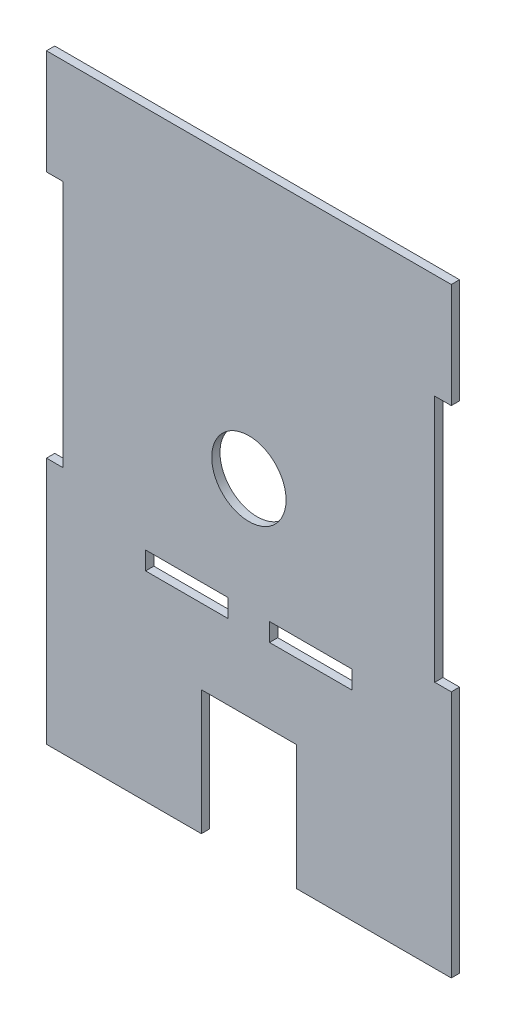
ISO-10303-21;
HEADER;
FILE_DESCRIPTION(('STEP AP214'),'2;1');
FILE_NAME('part.step','',(''),(''),'','','');
FILE_SCHEMA(('AUTOMOTIVE_DESIGN { 1 0 10303 214 1 1 1 1 }'));
ENDSEC;
DATA;
#1=APPLICATION_CONTEXT('core data for automotive mechanical design processes');
#2=APPLICATION_PROTOCOL_DEFINITION('international standard','automotive_design',2000,#1);
#3=PRODUCT_CONTEXT('',#1,'mechanical');
#4=PRODUCT('Part','Part','',(#3));
#5=PRODUCT_RELATED_PRODUCT_CATEGORY('part','',(#4));
#6=PRODUCT_DEFINITION_FORMATION('','',#4);
#7=PRODUCT_DEFINITION_CONTEXT('part definition',#1,'design');
#8=PRODUCT_DEFINITION('design','',#6,#7);
#9=PRODUCT_DEFINITION_SHAPE('','',#8);
#10=(LENGTH_UNIT() NAMED_UNIT(*) SI_UNIT(.MILLI.,.METRE.));
#11=(NAMED_UNIT(*) PLANE_ANGLE_UNIT() SI_UNIT($,.RADIAN.));
#12=(NAMED_UNIT(*) SI_UNIT($,.STERADIAN.) SOLID_ANGLE_UNIT());
#13=UNCERTAINTY_MEASURE_WITH_UNIT(LENGTH_MEASURE(1.E-05),#10,'distance_accuracy_value','');
#14=(GEOMETRIC_REPRESENTATION_CONTEXT(3) GLOBAL_UNCERTAINTY_ASSIGNED_CONTEXT((#13)) GLOBAL_UNIT_ASSIGNED_CONTEXT((#10,
#11,#12)) REPRESENTATION_CONTEXT('',''));
#15=CARTESIAN_POINT('',(0.,0.,0.));
#16=DIRECTION('',(0.,0.,1.));
#17=DIRECTION('',(1.,0.,0.));
#18=AXIS2_PLACEMENT_3D('',#15,#16,#17);
#19=CARTESIAN_POINT('',(0.,0.,1.));
#20=DIRECTION('',(0.,0.,-1.));
#21=DIRECTION('',(-1.,0.,0.));
#22=AXIS2_PLACEMENT_3D('',#19,#20,#21);
#23=PLANE('',#22);
#24=DIRECTION('',(1.,0.,0.));
#25=VECTOR('',#24,1.);
#26=CARTESIAN_POINT('',(31.2820184100364,27.8252807349729,1.));
#27=LINE('',#26,#25);
#28=CARTESIAN_POINT('',(31.2820184100364,27.8252807349729,1.));
#29=VERTEX_POINT('',#28);
#30=CARTESIAN_POINT('',(41.2820184100364,27.8252807349729,1.));
#31=VERTEX_POINT('',#30);
#32=EDGE_CURVE('E249',#29,#31,#27,.T.);
#33=ORIENTED_EDGE('',*,*,#32,.F.);
#34=DIRECTION('',(0.,-1.,0.));
#35=VECTOR('',#34,1.);
#36=CARTESIAN_POINT('',(31.2820184100364,27.8252807349729,1.));
#37=LINE('',#36,#35);
#38=CARTESIAN_POINT('',(31.2820184100364,30.0252807349739,1.));
#39=VERTEX_POINT('',#38);
#40=EDGE_CURVE('E260',#39,#29,#37,.T.);
#41=ORIENTED_EDGE('',*,*,#40,.F.);
#42=DIRECTION('',(-1.,0.,0.));
#43=VECTOR('',#42,1.);
#44=CARTESIAN_POINT('',(41.2820184100364,30.0252807349739,1.));
#45=LINE('',#44,#43);
#46=CARTESIAN_POINT('',(41.2820184100364,30.0252807349739,1.));
#47=VERTEX_POINT('',#46);
#48=EDGE_CURVE('E256',#47,#39,#45,.T.);
#49=ORIENTED_EDGE('',*,*,#48,.F.);
#50=DIRECTION('',(0.,1.,0.));
#51=VECTOR('',#50,1.);
#52=CARTESIAN_POINT('',(41.2820184100364,27.8252807349729,1.));
#53=LINE('',#52,#51);
#54=EDGE_CURVE('E252',#31,#47,#53,.T.);
#55=ORIENTED_EDGE('',*,*,#54,.F.);
#56=EDGE_LOOP('',(#33,#41,#49,#55));
#57=FACE_BOUND('',#56,.T.);
#58=DIRECTION('',(1.,0.,0.));
#59=VECTOR('',#58,1.);
#60=CARTESIAN_POINT('',(23.0320184100396,3.65221733864315,1.));
#61=LINE('',#60,#59);
#62=CARTESIAN_POINT('',(4.2820184100225,3.65221733864315,1.));
#63=VERTEX_POINT('',#62);
#64=CARTESIAN_POINT('',(23.0320184100396,3.65221733864315,1.));
#65=VERTEX_POINT('',#64);
#66=EDGE_CURVE('E300',#63,#65,#61,.T.);
#67=ORIENTED_EDGE('',*,*,#66,.T.);
#68=DIRECTION('',(0.,1.,0.));
#69=VECTOR('',#68,1.);
#70=CARTESIAN_POINT('',(23.0320184100396,18.7522173386419,1.));
#71=LINE('',#70,#69);
#72=CARTESIAN_POINT('',(23.0320184100396,18.7522173386419,1.));
#73=VERTEX_POINT('',#72);
#74=EDGE_CURVE('E304',#65,#73,#71,.T.);
#75=ORIENTED_EDGE('',*,*,#74,.T.);
#76=DIRECTION('',(1.,0.,0.));
#77=VECTOR('',#76,1.);
#78=CARTESIAN_POINT('',(28.78201841004,18.7522173386419,1.));
#79=LINE('',#78,#77);
#80=CARTESIAN_POINT('',(34.53201841004,18.7522173386419,1.));
#81=VERTEX_POINT('',#80);
#82=EDGE_CURVE('E308',#73,#81,#79,.T.);
#83=ORIENTED_EDGE('',*,*,#82,.T.);
#84=DIRECTION('',(0.,-1.,0.));
#85=VECTOR('',#84,1.);
#86=CARTESIAN_POINT('',(34.53201841004,3.65221733864315,1.));
#87=LINE('',#86,#85);
#88=CARTESIAN_POINT('',(34.53201841004,3.65221733864315,1.));
#89=VERTEX_POINT('',#88);
#90=EDGE_CURVE('E311',#81,#89,#87,.T.);
#91=ORIENTED_EDGE('',*,*,#90,.T.);
#92=DIRECTION('',(1.,0.,0.));
#93=VECTOR('',#92,1.);
#94=CARTESIAN_POINT('',(53.2820184100396,3.65221733864315,1.));
#95=LINE('',#94,#93);
#96=CARTESIAN_POINT('',(53.2820184100396,3.65221733864315,1.));
#97=VERTEX_POINT('',#96);
#98=EDGE_CURVE('E314',#89,#97,#95,.T.);
#99=ORIENTED_EDGE('',*,*,#98,.T.);
#100=DIRECTION('',(0.,1.,0.));
#101=VECTOR('',#100,1.);
#102=CARTESIAN_POINT('',(53.2820184100396,33.6522173386441,1.));
#103=LINE('',#102,#101);
#104=CARTESIAN_POINT('',(53.2820184100396,33.6522173386441,1.));
#105=VERTEX_POINT('',#104);
#106=EDGE_CURVE('E317',#97,#105,#103,.T.);
#107=ORIENTED_EDGE('',*,*,#106,.T.);
#108=DIRECTION('',(-1.,0.,0.));
#109=VECTOR('',#108,1.);
#110=CARTESIAN_POINT('',(53.2820184100396,33.6522173386441,1.));
#111=LINE('',#110,#109);
#112=CARTESIAN_POINT('',(51.28201841004,33.6522173386441,1.));
#113=VERTEX_POINT('',#112);
#114=EDGE_CURVE('E320',#105,#113,#111,.T.);
#115=ORIENTED_EDGE('',*,*,#114,.T.);
#116=DIRECTION('',(0.,1.,0.));
#117=VECTOR('',#116,1.);
#118=CARTESIAN_POINT('',(51.28201841004,63.6522173386432,1.));
#119=LINE('',#118,#117);
#120=CARTESIAN_POINT('',(51.28201841004,63.6522173386432,1.));
#121=VERTEX_POINT('',#120);
#122=EDGE_CURVE('E323',#113,#121,#119,.T.);
#123=ORIENTED_EDGE('',*,*,#122,.T.);
#124=DIRECTION('',(1.,0.,0.));
#125=VECTOR('',#124,1.);
#126=CARTESIAN_POINT('',(53.2820184100396,63.6522173386432,1.));
#127=LINE('',#126,#125);
#128=CARTESIAN_POINT('',(53.2820184100396,63.6522173386432,1.));
#129=VERTEX_POINT('',#128);
#130=EDGE_CURVE('E326',#121,#129,#127,.T.);
#131=ORIENTED_EDGE('',*,*,#130,.T.);
#132=DIRECTION('',(0.,1.,0.));
#133=VECTOR('',#132,1.);
#134=CARTESIAN_POINT('',(53.2820184100396,76.3538627526525,1.));
#135=LINE('',#134,#133);
#136=CARTESIAN_POINT('',(53.2820184100396,76.3538627526525,1.));
#137=VERTEX_POINT('',#136);
#138=EDGE_CURVE('E329',#129,#137,#135,.T.);
#139=ORIENTED_EDGE('',*,*,#138,.T.);
#140=DIRECTION('',(-1.,0.,0.));
#141=VECTOR('',#140,1.);
#142=CARTESIAN_POINT('',(4.2820184100225,76.3538627526525,1.));
#143=LINE('',#142,#141);
#144=CARTESIAN_POINT('',(4.2820184100225,76.3538627526525,1.));
#145=VERTEX_POINT('',#144);
#146=EDGE_CURVE('E332',#137,#145,#143,.T.);
#147=ORIENTED_EDGE('',*,*,#146,.T.);
#148=DIRECTION('',(0.,-1.,0.));
#149=VECTOR('',#148,1.);
#150=CARTESIAN_POINT('',(4.2820184100225,76.3538627526525,1.));
#151=LINE('',#150,#149);
#152=CARTESIAN_POINT('',(4.2820184100225,63.6522173386432,1.));
#153=VERTEX_POINT('',#152);
#154=EDGE_CURVE('E335',#145,#153,#151,.T.);
#155=ORIENTED_EDGE('',*,*,#154,.T.);
#156=DIRECTION('',(1.,0.,0.));
#157=VECTOR('',#156,1.);
#158=CARTESIAN_POINT('',(4.2820184100225,63.6522173386432,1.));
#159=LINE('',#158,#157);
#160=CARTESIAN_POINT('',(6.2820184100225,63.6522173386432,1.));
#161=VERTEX_POINT('',#160);
#162=EDGE_CURVE('E338',#153,#161,#159,.T.);
#163=ORIENTED_EDGE('',*,*,#162,.T.);
#164=DIRECTION('',(0.,-1.,0.));
#165=VECTOR('',#164,1.);
#166=CARTESIAN_POINT('',(6.2820184100225,63.6522173386432,1.));
#167=LINE('',#166,#165);
#168=CARTESIAN_POINT('',(6.2820184100225,33.6522173386441,1.));
#169=VERTEX_POINT('',#168);
#170=EDGE_CURVE('E341',#161,#169,#167,.T.);
#171=ORIENTED_EDGE('',*,*,#170,.T.);
#172=DIRECTION('',(-1.,0.,0.));
#173=VECTOR('',#172,1.);
#174=CARTESIAN_POINT('',(4.2820184100225,33.6522173386441,1.));
#175=LINE('',#174,#173);
#176=CARTESIAN_POINT('',(4.2820184100225,33.6522173386441,1.));
#177=VERTEX_POINT('',#176);
#178=EDGE_CURVE('E344',#169,#177,#175,.T.);
#179=ORIENTED_EDGE('',*,*,#178,.T.);
#180=DIRECTION('',(0.,-1.,0.));
#181=VECTOR('',#180,1.);
#182=CARTESIAN_POINT('',(4.2820184100225,3.65221733864315,1.));
#183=LINE('',#182,#181);
#184=EDGE_CURVE('E347',#177,#63,#183,.T.);
#185=ORIENTED_EDGE('',*,*,#184,.T.);
#186=EDGE_LOOP('',(#67,#75,#83,#91,#99,#107,#115,#123,#131,#139,#147,#155,#163,#171,#179,#185));
#187=FACE_BOUND('',#186,.T.);
#188=CARTESIAN_POINT('',(28.78201841004,43.7522173386419,1.));
#189=DIRECTION('',(0.,0.,1.));
#190=DIRECTION('',(1.,0.,0.));
#191=AXIS2_PLACEMENT_3D('',#188,#189,#190);
#192=CIRCLE('',#191,4.5);
#193=CARTESIAN_POINT('',(33.28201841004,43.7522173386419,1.));
#194=VERTEX_POINT('',#193);
#195=EDGE_CURVE('E292',#194,#194,#192,.T.);
#196=ORIENTED_EDGE('',*,*,#195,.F.);
#197=EDGE_LOOP('',(#196));
#198=FACE_BOUND('',#197,.T.);
#199=DIRECTION('',(1.,0.,0.));
#200=VECTOR('',#199,1.);
#201=CARTESIAN_POINT('',(26.2820184100423,27.8252807349729,1.));
#202=LINE('',#201,#200);
#203=CARTESIAN_POINT('',(16.2820184100432,27.8252807349729,1.));
#204=VERTEX_POINT('',#203);
#205=CARTESIAN_POINT('',(26.2820184100423,27.8252807349729,1.));
#206=VERTEX_POINT('',#205);
#207=EDGE_CURVE('E201',#204,#206,#202,.T.);
#208=ORIENTED_EDGE('',*,*,#207,.F.);
#209=DIRECTION('',(0.,-1.,0.));
#210=VECTOR('',#209,1.);
#211=CARTESIAN_POINT('',(16.2820184100432,27.8252807349729,1.));
#212=LINE('',#211,#210);
#213=CARTESIAN_POINT('',(16.2820184100432,30.0252807349739,1.));
#214=VERTEX_POINT('',#213);
#215=EDGE_CURVE('E227',#214,#204,#212,.T.);
#216=ORIENTED_EDGE('',*,*,#215,.F.);
#217=DIRECTION('',(-1.,0.,0.));
#218=VECTOR('',#217,1.);
#219=CARTESIAN_POINT('',(26.2820184100423,30.0252807349739,1.));
#220=LINE('',#219,#218);
#221=CARTESIAN_POINT('',(26.2820184100423,30.0252807349739,1.));
#222=VERTEX_POINT('',#221);
#223=EDGE_CURVE('E223',#222,#214,#220,.T.);
#224=ORIENTED_EDGE('',*,*,#223,.F.);
#225=DIRECTION('',(0.,1.,0.));
#226=VECTOR('',#225,1.);
#227=CARTESIAN_POINT('',(26.2820184100423,27.8252807349729,1.));
#228=LINE('',#227,#226);
#229=EDGE_CURVE('E210',#206,#222,#228,.T.);
#230=ORIENTED_EDGE('',*,*,#229,.F.);
#231=EDGE_LOOP('',(#208,#216,#224,#230));
#232=FACE_BOUND('',#231,.T.);
#233=ADVANCED_FACE('F39',(#57,#187,#198,#232),#23,.F.);
#234=CARTESIAN_POINT('',(0.,0.,0.));
#235=DIRECTION('',(0.,0.,-1.));
#236=DIRECTION('',(-1.,0.,0.));
#237=AXIS2_PLACEMENT_3D('',#234,#235,#236);
#238=PLANE('',#237);
#239=DIRECTION('',(1.,0.,0.));
#240=VECTOR('',#239,1.);
#241=CARTESIAN_POINT('',(23.0320184100396,3.65221733864315,0.));
#242=LINE('',#241,#240);
#243=CARTESIAN_POINT('',(4.2820184100225,3.65221733864315,0.));
#244=VERTEX_POINT('',#243);
#245=CARTESIAN_POINT('',(23.0320184100396,3.65221733864315,0.));
#246=VERTEX_POINT('',#245);
#247=EDGE_CURVE('E296',#244,#246,#242,.T.);
#248=ORIENTED_EDGE('',*,*,#247,.F.);
#249=DIRECTION('',(0.,-1.,0.));
#250=VECTOR('',#249,1.);
#251=CARTESIAN_POINT('',(4.2820184100225,3.65221733864315,0.));
#252=LINE('',#251,#250);
#253=CARTESIAN_POINT('',(4.2820184100225,33.6522173386441,0.));
#254=VERTEX_POINT('',#253);
#255=EDGE_CURVE('E305',#254,#244,#252,.T.);
#256=ORIENTED_EDGE('',*,*,#255,.F.);
#257=DIRECTION('',(-1.,0.,0.));
#258=VECTOR('',#257,1.);
#259=CARTESIAN_POINT('',(4.2820184100225,33.6522173386441,0.));
#260=LINE('',#259,#258);
#261=CARTESIAN_POINT('',(6.2820184100225,33.6522173386441,0.));
#262=VERTEX_POINT('',#261);
#263=EDGE_CURVE('E394',#262,#254,#260,.T.);
#264=ORIENTED_EDGE('',*,*,#263,.F.);
#265=DIRECTION('',(0.,-1.,0.));
#266=VECTOR('',#265,1.);
#267=CARTESIAN_POINT('',(6.2820184100225,63.6522173386432,0.));
#268=LINE('',#267,#266);
#269=CARTESIAN_POINT('',(6.2820184100225,63.6522173386432,0.));
#270=VERTEX_POINT('',#269);
#271=EDGE_CURVE('E391',#270,#262,#268,.T.);
#272=ORIENTED_EDGE('',*,*,#271,.F.);
#273=DIRECTION('',(1.,0.,0.));
#274=VECTOR('',#273,1.);
#275=CARTESIAN_POINT('',(4.2820184100225,63.6522173386432,0.));
#276=LINE('',#275,#274);
#277=CARTESIAN_POINT('',(4.2820184100225,63.6522173386432,0.));
#278=VERTEX_POINT('',#277);
#279=EDGE_CURVE('E388',#278,#270,#276,.T.);
#280=ORIENTED_EDGE('',*,*,#279,.F.);
#281=DIRECTION('',(0.,-1.,0.));
#282=VECTOR('',#281,1.);
#283=CARTESIAN_POINT('',(4.2820184100225,76.3538627526525,0.));
#284=LINE('',#283,#282);
#285=CARTESIAN_POINT('',(4.2820184100225,76.3538627526525,0.));
#286=VERTEX_POINT('',#285);
#287=EDGE_CURVE('E385',#286,#278,#284,.T.);
#288=ORIENTED_EDGE('',*,*,#287,.F.);
#289=DIRECTION('',(-1.,0.,0.));
#290=VECTOR('',#289,1.);
#291=CARTESIAN_POINT('',(4.2820184100225,76.3538627526525,0.));
#292=LINE('',#291,#290);
#293=CARTESIAN_POINT('',(53.2820184100396,76.3538627526525,0.));
#294=VERTEX_POINT('',#293);
#295=EDGE_CURVE('E382',#294,#286,#292,.T.);
#296=ORIENTED_EDGE('',*,*,#295,.F.);
#297=DIRECTION('',(0.,1.,0.));
#298=VECTOR('',#297,1.);
#299=CARTESIAN_POINT('',(53.2820184100396,76.3538627526525,0.));
#300=LINE('',#299,#298);
#301=CARTESIAN_POINT('',(53.2820184100396,63.6522173386432,0.));
#302=VERTEX_POINT('',#301);
#303=EDGE_CURVE('E379',#302,#294,#300,.T.);
#304=ORIENTED_EDGE('',*,*,#303,.F.);
#305=DIRECTION('',(1.,0.,0.));
#306=VECTOR('',#305,1.);
#307=CARTESIAN_POINT('',(53.2820184100396,63.6522173386432,0.));
#308=LINE('',#307,#306);
#309=CARTESIAN_POINT('',(51.28201841004,63.6522173386432,0.));
#310=VERTEX_POINT('',#309);
#311=EDGE_CURVE('E376',#310,#302,#308,.T.);
#312=ORIENTED_EDGE('',*,*,#311,.F.);
#313=DIRECTION('',(0.,1.,0.));
#314=VECTOR('',#313,1.);
#315=CARTESIAN_POINT('',(51.28201841004,63.6522173386432,0.));
#316=LINE('',#315,#314);
#317=CARTESIAN_POINT('',(51.28201841004,33.6522173386441,0.));
#318=VERTEX_POINT('',#317);
#319=EDGE_CURVE('E373',#318,#310,#316,.T.);
#320=ORIENTED_EDGE('',*,*,#319,.F.);
#321=DIRECTION('',(-1.,0.,0.));
#322=VECTOR('',#321,1.);
#323=CARTESIAN_POINT('',(53.2820184100396,33.6522173386441,0.));
#324=LINE('',#323,#322);
#325=CARTESIAN_POINT('',(53.2820184100396,33.6522173386441,0.));
#326=VERTEX_POINT('',#325);
#327=EDGE_CURVE('E370',#326,#318,#324,.T.);
#328=ORIENTED_EDGE('',*,*,#327,.F.);
#329=DIRECTION('',(0.,1.,0.));
#330=VECTOR('',#329,1.);
#331=CARTESIAN_POINT('',(53.2820184100396,33.6522173386441,0.));
#332=LINE('',#331,#330);
#333=CARTESIAN_POINT('',(53.2820184100396,3.65221733864315,0.));
#334=VERTEX_POINT('',#333);
#335=EDGE_CURVE('E367',#334,#326,#332,.T.);
#336=ORIENTED_EDGE('',*,*,#335,.F.);
#337=DIRECTION('',(1.,0.,0.));
#338=VECTOR('',#337,1.);
#339=CARTESIAN_POINT('',(53.2820184100396,3.65221733864315,0.));
#340=LINE('',#339,#338);
#341=CARTESIAN_POINT('',(34.53201841004,3.65221733864315,0.));
#342=VERTEX_POINT('',#341);
#343=EDGE_CURVE('E364',#342,#334,#340,.T.);
#344=ORIENTED_EDGE('',*,*,#343,.F.);
#345=DIRECTION('',(0.,-1.,0.));
#346=VECTOR('',#345,1.);
#347=CARTESIAN_POINT('',(34.53201841004,3.65221733864315,0.));
#348=LINE('',#347,#346);
#349=CARTESIAN_POINT('',(34.53201841004,18.7522173386419,0.));
#350=VERTEX_POINT('',#349);
#351=EDGE_CURVE('E361',#350,#342,#348,.T.);
#352=ORIENTED_EDGE('',*,*,#351,.F.);
#353=DIRECTION('',(1.,0.,0.));
#354=VECTOR('',#353,1.);
#355=CARTESIAN_POINT('',(34.53201841004,18.7522173386419,0.));
#356=LINE('',#355,#354);
#357=CARTESIAN_POINT('',(23.0320184100396,18.7522173386419,0.));
#358=VERTEX_POINT('',#357);
#359=EDGE_CURVE('E358',#358,#350,#356,.T.);
#360=ORIENTED_EDGE('',*,*,#359,.F.);
#361=DIRECTION('',(0.,1.,0.));
#362=VECTOR('',#361,1.);
#363=CARTESIAN_POINT('',(23.0320184100396,18.7522173386419,0.));
#364=LINE('',#363,#362);
#365=EDGE_CURVE('E354',#246,#358,#364,.T.);
#366=ORIENTED_EDGE('',*,*,#365,.F.);
#367=EDGE_LOOP('',(#248,#256,#264,#272,#280,#288,#296,#304,#312,#320,#328,#336,#344,#352,#360,#366));
#368=FACE_BOUND('',#367,.T.);
#369=CARTESIAN_POINT('',(28.78201841004,43.7522173386419,0.));
#370=DIRECTION('',(0.,0.,1.));
#371=DIRECTION('',(1.,0.,0.));
#372=AXIS2_PLACEMENT_3D('',#369,#370,#371);
#373=CIRCLE('',#372,4.5);
#374=CARTESIAN_POINT('',(33.28201841004,43.7522173386419,0.));
#375=VERTEX_POINT('',#374);
#376=EDGE_CURVE('E291',#375,#375,#373,.T.);
#377=ORIENTED_EDGE('',*,*,#376,.T.);
#378=EDGE_LOOP('',(#377));
#379=FACE_BOUND('',#378,.T.);
#380=DIRECTION('',(0.,-1.,0.));
#381=VECTOR('',#380,1.);
#382=CARTESIAN_POINT('',(31.2820184100364,27.8252807349729,0.));
#383=LINE('',#382,#381);
#384=CARTESIAN_POINT('',(31.2820184100364,30.0252807349739,0.));
#385=VERTEX_POINT('',#384);
#386=CARTESIAN_POINT('',(31.2820184100364,27.8252807349729,0.));
#387=VERTEX_POINT('',#386);
#388=EDGE_CURVE('E253',#385,#387,#383,.T.);
#389=ORIENTED_EDGE('',*,*,#388,.T.);
#390=DIRECTION('',(1.,0.,0.));
#391=VECTOR('',#390,1.);
#392=CARTESIAN_POINT('',(31.2820184100364,27.8252807349729,0.));
#393=LINE('',#392,#391);
#394=CARTESIAN_POINT('',(41.2820184100364,27.8252807349729,0.));
#395=VERTEX_POINT('',#394);
#396=EDGE_CURVE('E219',#387,#395,#393,.T.);
#397=ORIENTED_EDGE('',*,*,#396,.T.);
#398=DIRECTION('',(0.,1.,0.));
#399=VECTOR('',#398,1.);
#400=CARTESIAN_POINT('',(41.2820184100364,27.8252807349729,0.));
#401=LINE('',#400,#399);
#402=CARTESIAN_POINT('',(41.2820184100364,30.0252807349739,0.));
#403=VERTEX_POINT('',#402);
#404=EDGE_CURVE('E267',#395,#403,#401,.T.);
#405=ORIENTED_EDGE('',*,*,#404,.T.);
#406=DIRECTION('',(-1.,0.,0.));
#407=VECTOR('',#406,1.);
#408=CARTESIAN_POINT('',(41.2820184100364,30.0252807349739,0.));
#409=LINE('',#408,#407);
#410=EDGE_CURVE('E271',#403,#385,#409,.T.);
#411=ORIENTED_EDGE('',*,*,#410,.T.);
#412=EDGE_LOOP('',(#389,#397,#405,#411));
#413=FACE_BOUND('',#412,.T.);
#414=DIRECTION('',(0.,-1.,0.));
#415=VECTOR('',#414,1.);
#416=CARTESIAN_POINT('',(16.2820184100432,27.8252807349729,0.));
#417=LINE('',#416,#415);
#418=CARTESIAN_POINT('',(16.2820184100432,30.0252807349739,0.));
#419=VERTEX_POINT('',#418);
#420=CARTESIAN_POINT('',(16.2820184100432,27.8252807349729,0.));
#421=VERTEX_POINT('',#420);
#422=EDGE_CURVE('E211',#419,#421,#417,.T.);
#423=ORIENTED_EDGE('',*,*,#422,.T.);
#424=DIRECTION('',(1.,0.,0.));
#425=VECTOR('',#424,1.);
#426=CARTESIAN_POINT('',(26.2820184100423,27.8252807349729,0.));
#427=LINE('',#426,#425);
#428=CARTESIAN_POINT('',(26.2820184100423,27.8252807349729,0.));
#429=VERTEX_POINT('',#428);
#430=EDGE_CURVE('E63',#421,#429,#427,.T.);
#431=ORIENTED_EDGE('',*,*,#430,.T.);
#432=DIRECTION('',(0.,1.,0.));
#433=VECTOR('',#432,1.);
#434=CARTESIAN_POINT('',(26.2820184100423,27.8252807349729,0.));
#435=LINE('',#434,#433);
#436=CARTESIAN_POINT('',(26.2820184100423,30.0252807349739,0.));
#437=VERTEX_POINT('',#436);
#438=EDGE_CURVE('E217',#429,#437,#435,.T.);
#439=ORIENTED_EDGE('',*,*,#438,.T.);
#440=DIRECTION('',(-1.,0.,0.));
#441=VECTOR('',#440,1.);
#442=CARTESIAN_POINT('',(26.2820184100423,30.0252807349739,0.));
#443=LINE('',#442,#441);
#444=EDGE_CURVE('E236',#437,#419,#443,.T.);
#445=ORIENTED_EDGE('',*,*,#444,.T.);
#446=EDGE_LOOP('',(#423,#431,#439,#445));
#447=FACE_BOUND('',#446,.T.);
#448=ADVANCED_FACE('F465',(#368,#379,#413,#447),#238,.T.);
#449=CARTESIAN_POINT('',(23.0320184100396,3.65221733864315,1.));
#450=DIRECTION('',(0.,1.,0.));
#451=DIRECTION('',(0.,0.,1.));
#452=AXIS2_PLACEMENT_3D('',#449,#450,#451);
#453=PLANE('',#452);
#454=ORIENTED_EDGE('',*,*,#247,.T.);
#455=DIRECTION('',(0.,0.,-1.));
#456=VECTOR('',#455,1.);
#457=CARTESIAN_POINT('',(23.0320184100396,3.65221733864315,1.));
#458=LINE('',#457,#456);
#459=EDGE_CURVE('E11',#65,#246,#458,.T.);
#460=ORIENTED_EDGE('',*,*,#459,.F.);
#461=ORIENTED_EDGE('',*,*,#66,.F.);
#462=DIRECTION('',(0.,0.,-1.));
#463=VECTOR('',#462,1.);
#464=CARTESIAN_POINT('',(4.2820184100225,3.65221733864315,1.));
#465=LINE('',#464,#463);
#466=EDGE_CURVE('E350',#63,#244,#465,.T.);
#467=ORIENTED_EDGE('',*,*,#466,.T.);
#468=EDGE_LOOP('',(#454,#460,#461,#467));
#469=FACE_BOUND('',#468,.T.);
#470=ADVANCED_FACE('F41',(#469),#453,.F.);
#471=CARTESIAN_POINT('',(23.0320184100396,18.7522173386419,1.));
#472=DIRECTION('',(-1.,0.,0.));
#473=DIRECTION('',(0.,0.,1.));
#474=AXIS2_PLACEMENT_3D('',#471,#472,#473);
#475=PLANE('',#474);
#476=ORIENTED_EDGE('',*,*,#365,.T.);
#477=DIRECTION('',(0.,0.,-1.));
#478=VECTOR('',#477,1.);
#479=CARTESIAN_POINT('',(23.0320184100396,18.7522173386419,1.));
#480=LINE('',#479,#478);
#481=EDGE_CURVE('E48',#73,#358,#480,.T.);
#482=ORIENTED_EDGE('',*,*,#481,.F.);
#483=ORIENTED_EDGE('',*,*,#74,.F.);
#484=ORIENTED_EDGE('',*,*,#459,.T.);
#485=EDGE_LOOP('',(#476,#482,#483,#484));
#486=FACE_BOUND('',#485,.T.);
#487=ADVANCED_FACE('F461',(#486),#475,.F.);
#488=CARTESIAN_POINT('',(34.53201841004,18.7522173386419,1.));
#489=DIRECTION('',(0.,1.,0.));
#490=DIRECTION('',(0.,0.,1.));
#491=AXIS2_PLACEMENT_3D('',#488,#489,#490);
#492=PLANE('',#491);
#493=ORIENTED_EDGE('',*,*,#359,.T.);
#494=DIRECTION('',(0.,0.,-1.));
#495=VECTOR('',#494,1.);
#496=CARTESIAN_POINT('',(34.53201841004,18.7522173386419,1.));
#497=LINE('',#496,#495);
#498=EDGE_CURVE('E450',#81,#350,#497,.T.);
#499=ORIENTED_EDGE('',*,*,#498,.F.);
#500=ORIENTED_EDGE('',*,*,#82,.F.);
#501=ORIENTED_EDGE('',*,*,#481,.T.);
#502=EDGE_LOOP('',(#493,#499,#500,#501));
#503=FACE_BOUND('',#502,.T.);
#504=ADVANCED_FACE('F458',(#503),#492,.F.);
#505=CARTESIAN_POINT('',(34.53201841004,3.65221733864315,1.));
#506=DIRECTION('',(1.,0.,0.));
#507=DIRECTION('',(0.,0.,-1.));
#508=AXIS2_PLACEMENT_3D('',#505,#506,#507);
#509=PLANE('',#508);
#510=ORIENTED_EDGE('',*,*,#351,.T.);
#511=DIRECTION('',(0.,0.,-1.));
#512=VECTOR('',#511,1.);
#513=CARTESIAN_POINT('',(34.53201841004,3.65221733864315,1.));
#514=LINE('',#513,#512);
#515=EDGE_CURVE('E446',#89,#342,#514,.T.);
#516=ORIENTED_EDGE('',*,*,#515,.F.);
#517=ORIENTED_EDGE('',*,*,#90,.F.);
#518=ORIENTED_EDGE('',*,*,#498,.T.);
#519=EDGE_LOOP('',(#510,#516,#517,#518));
#520=FACE_BOUND('',#519,.T.);
#521=ADVANCED_FACE('F473',(#520),#509,.F.);
#522=CARTESIAN_POINT('',(53.2820184100396,3.65221733864315,1.));
#523=DIRECTION('',(0.,1.,0.));
#524=DIRECTION('',(0.,0.,1.));
#525=AXIS2_PLACEMENT_3D('',#522,#523,#524);
#526=PLANE('',#525);
#527=ORIENTED_EDGE('',*,*,#343,.T.);
#528=DIRECTION('',(0.,0.,-1.));
#529=VECTOR('',#528,1.);
#530=CARTESIAN_POINT('',(53.2820184100396,3.65221733864315,1.));
#531=LINE('',#530,#529);
#532=EDGE_CURVE('E442',#97,#334,#531,.T.);
#533=ORIENTED_EDGE('',*,*,#532,.F.);
#534=ORIENTED_EDGE('',*,*,#98,.F.);
#535=ORIENTED_EDGE('',*,*,#515,.T.);
#536=EDGE_LOOP('',(#527,#533,#534,#535));
#537=FACE_BOUND('',#536,.T.);
#538=ADVANCED_FACE('F477',(#537),#526,.F.);
#539=CARTESIAN_POINT('',(53.2820184100396,33.6522173386441,1.));
#540=DIRECTION('',(-1.,0.,0.));
#541=DIRECTION('',(0.,0.,1.));
#542=AXIS2_PLACEMENT_3D('',#539,#540,#541);
#543=PLANE('',#542);
#544=ORIENTED_EDGE('',*,*,#335,.T.);
#545=DIRECTION('',(0.,0.,-1.));
#546=VECTOR('',#545,1.);
#547=CARTESIAN_POINT('',(53.2820184100396,33.6522173386441,1.));
#548=LINE('',#547,#546);
#549=EDGE_CURVE('E438',#105,#326,#548,.T.);
#550=ORIENTED_EDGE('',*,*,#549,.F.);
#551=ORIENTED_EDGE('',*,*,#106,.F.);
#552=ORIENTED_EDGE('',*,*,#532,.T.);
#553=EDGE_LOOP('',(#544,#550,#551,#552));
#554=FACE_BOUND('',#553,.T.);
#555=ADVANCED_FACE('F535',(#554),#543,.F.);
#556=CARTESIAN_POINT('',(53.2820184100396,33.6522173386441,1.));
#557=DIRECTION('',(0.,-1.,0.));
#558=DIRECTION('',(0.,0.,-1.));
#559=AXIS2_PLACEMENT_3D('',#556,#557,#558);
#560=PLANE('',#559);
#561=ORIENTED_EDGE('',*,*,#327,.T.);
#562=DIRECTION('',(0.,0.,-1.));
#563=VECTOR('',#562,1.);
#564=CARTESIAN_POINT('',(51.28201841004,33.6522173386441,1.));
#565=LINE('',#564,#563);
#566=EDGE_CURVE('E434',#113,#318,#565,.T.);
#567=ORIENTED_EDGE('',*,*,#566,.F.);
#568=ORIENTED_EDGE('',*,*,#114,.F.);
#569=ORIENTED_EDGE('',*,*,#549,.T.);
#570=EDGE_LOOP('',(#561,#567,#568,#569));
#571=FACE_BOUND('',#570,.T.);
#572=ADVANCED_FACE('F533',(#571),#560,.F.);
#573=CARTESIAN_POINT('',(51.28201841004,63.6522173386432,1.));
#574=DIRECTION('',(-1.,0.,0.));
#575=DIRECTION('',(0.,0.,1.));
#576=AXIS2_PLACEMENT_3D('',#573,#574,#575);
#577=PLANE('',#576);
#578=ORIENTED_EDGE('',*,*,#319,.T.);
#579=DIRECTION('',(0.,0.,-1.));
#580=VECTOR('',#579,1.);
#581=CARTESIAN_POINT('',(51.28201841004,63.6522173386432,1.));
#582=LINE('',#581,#580);
#583=EDGE_CURVE('E430',#121,#310,#582,.T.);
#584=ORIENTED_EDGE('',*,*,#583,.F.);
#585=ORIENTED_EDGE('',*,*,#122,.F.);
#586=ORIENTED_EDGE('',*,*,#566,.T.);
#587=EDGE_LOOP('',(#578,#584,#585,#586));
#588=FACE_BOUND('',#587,.T.);
#589=ADVANCED_FACE('F529',(#588),#577,.F.);
#590=CARTESIAN_POINT('',(53.2820184100396,63.6522173386432,1.));
#591=DIRECTION('',(0.,1.,0.));
#592=DIRECTION('',(0.,0.,1.));
#593=AXIS2_PLACEMENT_3D('',#590,#591,#592);
#594=PLANE('',#593);
#595=ORIENTED_EDGE('',*,*,#311,.T.);
#596=DIRECTION('',(0.,0.,-1.));
#597=VECTOR('',#596,1.);
#598=CARTESIAN_POINT('',(53.2820184100396,63.6522173386432,1.));
#599=LINE('',#598,#597);
#600=EDGE_CURVE('E426',#129,#302,#599,.T.);
#601=ORIENTED_EDGE('',*,*,#600,.F.);
#602=ORIENTED_EDGE('',*,*,#130,.F.);
#603=ORIENTED_EDGE('',*,*,#583,.T.);
#604=EDGE_LOOP('',(#595,#601,#602,#603));
#605=FACE_BOUND('',#604,.T.);
#606=ADVANCED_FACE('F524',(#605),#594,.F.);
#607=CARTESIAN_POINT('',(53.2820184100396,76.3538627526525,1.));
#608=DIRECTION('',(-1.,0.,0.));
#609=DIRECTION('',(0.,0.,1.));
#610=AXIS2_PLACEMENT_3D('',#607,#608,#609);
#611=PLANE('',#610);
#612=ORIENTED_EDGE('',*,*,#303,.T.);
#613=DIRECTION('',(0.,0.,-1.));
#614=VECTOR('',#613,1.);
#615=CARTESIAN_POINT('',(53.2820184100396,76.3538627526525,1.));
#616=LINE('',#615,#614);
#617=EDGE_CURVE('E422',#137,#294,#616,.T.);
#618=ORIENTED_EDGE('',*,*,#617,.F.);
#619=ORIENTED_EDGE('',*,*,#138,.F.);
#620=ORIENTED_EDGE('',*,*,#600,.T.);
#621=EDGE_LOOP('',(#612,#618,#619,#620));
#622=FACE_BOUND('',#621,.T.);
#623=ADVANCED_FACE('F518',(#622),#611,.F.);
#624=CARTESIAN_POINT('',(4.2820184100225,76.3538627526525,1.));
#625=DIRECTION('',(0.,-1.,0.));
#626=DIRECTION('',(0.,0.,-1.));
#627=AXIS2_PLACEMENT_3D('',#624,#625,#626);
#628=PLANE('',#627);
#629=ORIENTED_EDGE('',*,*,#295,.T.);
#630=DIRECTION('',(0.,0.,-1.));
#631=VECTOR('',#630,1.);
#632=CARTESIAN_POINT('',(4.2820184100225,76.3538627526525,1.));
#633=LINE('',#632,#631);
#634=EDGE_CURVE('E418',#145,#286,#633,.T.);
#635=ORIENTED_EDGE('',*,*,#634,.F.);
#636=ORIENTED_EDGE('',*,*,#146,.F.);
#637=ORIENTED_EDGE('',*,*,#617,.T.);
#638=EDGE_LOOP('',(#629,#635,#636,#637));
#639=FACE_BOUND('',#638,.T.);
#640=ADVANCED_FACE('F514',(#639),#628,.F.);
#641=CARTESIAN_POINT('',(4.2820184100225,76.3538627526525,1.));
#642=DIRECTION('',(1.,0.,0.));
#643=DIRECTION('',(0.,0.,-1.));
#644=AXIS2_PLACEMENT_3D('',#641,#642,#643);
#645=PLANE('',#644);
#646=ORIENTED_EDGE('',*,*,#287,.T.);
#647=DIRECTION('',(0.,0.,-1.));
#648=VECTOR('',#647,1.);
#649=CARTESIAN_POINT('',(4.2820184100225,63.6522173386432,1.));
#650=LINE('',#649,#648);
#651=EDGE_CURVE('E414',#153,#278,#650,.T.);
#652=ORIENTED_EDGE('',*,*,#651,.F.);
#653=ORIENTED_EDGE('',*,*,#154,.F.);
#654=ORIENTED_EDGE('',*,*,#634,.T.);
#655=EDGE_LOOP('',(#646,#652,#653,#654));
#656=FACE_BOUND('',#655,.T.);
#657=ADVANCED_FACE('F509',(#656),#645,.F.);
#658=CARTESIAN_POINT('',(4.2820184100225,63.6522173386432,1.));
#659=DIRECTION('',(0.,1.,0.));
#660=DIRECTION('',(0.,0.,1.));
#661=AXIS2_PLACEMENT_3D('',#658,#659,#660);
#662=PLANE('',#661);
#663=ORIENTED_EDGE('',*,*,#279,.T.);
#664=DIRECTION('',(0.,0.,-1.));
#665=VECTOR('',#664,1.);
#666=CARTESIAN_POINT('',(6.2820184100225,63.6522173386432,1.));
#667=LINE('',#666,#665);
#668=EDGE_CURVE('E410',#161,#270,#667,.T.);
#669=ORIENTED_EDGE('',*,*,#668,.F.);
#670=ORIENTED_EDGE('',*,*,#162,.F.);
#671=ORIENTED_EDGE('',*,*,#651,.T.);
#672=EDGE_LOOP('',(#663,#669,#670,#671));
#673=FACE_BOUND('',#672,.T.);
#674=ADVANCED_FACE('F503',(#673),#662,.F.);
#675=CARTESIAN_POINT('',(6.2820184100225,63.6522173386432,1.));
#676=DIRECTION('',(1.,0.,0.));
#677=DIRECTION('',(0.,0.,-1.));
#678=AXIS2_PLACEMENT_3D('',#675,#676,#677);
#679=PLANE('',#678);
#680=ORIENTED_EDGE('',*,*,#271,.T.);
#681=DIRECTION('',(0.,0.,-1.));
#682=VECTOR('',#681,1.);
#683=CARTESIAN_POINT('',(6.2820184100225,33.6522173386441,1.));
#684=LINE('',#683,#682);
#685=EDGE_CURVE('E406',#169,#262,#684,.T.);
#686=ORIENTED_EDGE('',*,*,#685,.F.);
#687=ORIENTED_EDGE('',*,*,#170,.F.);
#688=ORIENTED_EDGE('',*,*,#668,.T.);
#689=EDGE_LOOP('',(#680,#686,#687,#688));
#690=FACE_BOUND('',#689,.T.);
#691=ADVANCED_FACE('F499',(#690),#679,.F.);
#692=CARTESIAN_POINT('',(4.2820184100225,33.6522173386441,1.));
#693=DIRECTION('',(0.,-1.,0.));
#694=DIRECTION('',(0.,0.,-1.));
#695=AXIS2_PLACEMENT_3D('',#692,#693,#694);
#696=PLANE('',#695);
#697=ORIENTED_EDGE('',*,*,#263,.T.);
#698=DIRECTION('',(0.,0.,-1.));
#699=VECTOR('',#698,1.);
#700=CARTESIAN_POINT('',(4.2820184100225,33.6522173386441,1.));
#701=LINE('',#700,#699);
#702=EDGE_CURVE('E402',#177,#254,#701,.T.);
#703=ORIENTED_EDGE('',*,*,#702,.F.);
#704=ORIENTED_EDGE('',*,*,#178,.F.);
#705=ORIENTED_EDGE('',*,*,#685,.T.);
#706=EDGE_LOOP('',(#697,#703,#704,#705));
#707=FACE_BOUND('',#706,.T.);
#708=ADVANCED_FACE('F494',(#707),#696,.F.);
#709=CARTESIAN_POINT('',(4.2820184100225,3.65221733864315,1.));
#710=DIRECTION('',(1.,0.,0.));
#711=DIRECTION('',(0.,0.,-1.));
#712=AXIS2_PLACEMENT_3D('',#709,#710,#711);
#713=PLANE('',#712);
#714=ORIENTED_EDGE('',*,*,#255,.T.);
#715=ORIENTED_EDGE('',*,*,#466,.F.);
#716=ORIENTED_EDGE('',*,*,#184,.F.);
#717=ORIENTED_EDGE('',*,*,#702,.T.);
#718=EDGE_LOOP('',(#714,#715,#716,#717));
#719=FACE_BOUND('',#718,.T.);
#720=ADVANCED_FACE('F488',(#719),#713,.F.);
#721=CARTESIAN_POINT('',(28.78201841004,43.7522173386419,1.));
#722=DIRECTION('',(0.,0.,-1.));
#723=DIRECTION('',(-1.,0.,0.));
#724=AXIS2_PLACEMENT_3D('',#721,#722,#723);
#725=CYLINDRICAL_SURFACE('',#724,4.5);
#726=ORIENTED_EDGE('',*,*,#195,.T.);
#727=EDGE_LOOP('',(#726));
#728=FACE_BOUND('',#727,.T.);
#729=ORIENTED_EDGE('',*,*,#376,.F.);
#730=EDGE_LOOP('',(#729));
#731=FACE_BOUND('',#730,.T.);
#732=ADVANCED_FACE('F553',(#728,#731),#725,.F.);
#733=CARTESIAN_POINT('',(31.2820184100364,27.8252807349729,1.));
#734=DIRECTION('',(0.,1.,0.));
#735=DIRECTION('',(0.,0.,1.));
#736=AXIS2_PLACEMENT_3D('',#733,#734,#735);
#737=PLANE('',#736);
#738=ORIENTED_EDGE('',*,*,#396,.F.);
#739=DIRECTION('',(0.,0.,-1.));
#740=VECTOR('',#739,1.);
#741=CARTESIAN_POINT('',(31.2820184100364,27.8252807349729,1.));
#742=LINE('',#741,#740);
#743=EDGE_CURVE('E263',#29,#387,#742,.T.);
#744=ORIENTED_EDGE('',*,*,#743,.F.);
#745=ORIENTED_EDGE('',*,*,#32,.T.);
#746=DIRECTION('',(0.,0.,-1.));
#747=VECTOR('',#746,1.);
#748=CARTESIAN_POINT('',(41.2820184100364,27.8252807349729,1.));
#749=LINE('',#748,#747);
#750=EDGE_CURVE('E287',#31,#395,#749,.T.);
#751=ORIENTED_EDGE('',*,*,#750,.T.);
#752=EDGE_LOOP('',(#738,#744,#745,#751));
#753=FACE_BOUND('',#752,.T.);
#754=ADVANCED_FACE('F615',(#753),#737,.T.);
#755=CARTESIAN_POINT('',(41.2820184100364,27.8252807349729,1.));
#756=DIRECTION('',(-1.,0.,0.));
#757=DIRECTION('',(0.,0.,1.));
#758=AXIS2_PLACEMENT_3D('',#755,#756,#757);
#759=PLANE('',#758);
#760=ORIENTED_EDGE('',*,*,#404,.F.);
#761=ORIENTED_EDGE('',*,*,#750,.F.);
#762=ORIENTED_EDGE('',*,*,#54,.T.);
#763=DIRECTION('',(0.,0.,-1.));
#764=VECTOR('',#763,1.);
#765=CARTESIAN_POINT('',(41.2820184100364,30.0252807349739,1.));
#766=LINE('',#765,#764);
#767=EDGE_CURVE('E284',#47,#403,#766,.T.);
#768=ORIENTED_EDGE('',*,*,#767,.T.);
#769=EDGE_LOOP('',(#760,#761,#762,#768));
#770=FACE_BOUND('',#769,.T.);
#771=ADVANCED_FACE('F622',(#770),#759,.T.);
#772=CARTESIAN_POINT('',(41.2820184100364,30.0252807349739,1.));
#773=DIRECTION('',(0.,-1.,0.));
#774=DIRECTION('',(0.,0.,-1.));
#775=AXIS2_PLACEMENT_3D('',#772,#773,#774);
#776=PLANE('',#775);
#777=ORIENTED_EDGE('',*,*,#410,.F.);
#778=ORIENTED_EDGE('',*,*,#767,.F.);
#779=ORIENTED_EDGE('',*,*,#48,.T.);
#780=DIRECTION('',(0.,0.,-1.));
#781=VECTOR('',#780,1.);
#782=CARTESIAN_POINT('',(31.2820184100364,30.0252807349739,1.));
#783=LINE('',#782,#781);
#784=EDGE_CURVE('E281',#39,#385,#783,.T.);
#785=ORIENTED_EDGE('',*,*,#784,.T.);
#786=EDGE_LOOP('',(#777,#778,#779,#785));
#787=FACE_BOUND('',#786,.T.);
#788=ADVANCED_FACE('F629',(#787),#776,.T.);
#789=CARTESIAN_POINT('',(31.2820184100364,27.8252807349729,1.));
#790=DIRECTION('',(1.,0.,0.));
#791=DIRECTION('',(0.,0.,-1.));
#792=AXIS2_PLACEMENT_3D('',#789,#790,#791);
#793=PLANE('',#792);
#794=ORIENTED_EDGE('',*,*,#388,.F.);
#795=ORIENTED_EDGE('',*,*,#784,.F.);
#796=ORIENTED_EDGE('',*,*,#40,.T.);
#797=ORIENTED_EDGE('',*,*,#743,.T.);
#798=EDGE_LOOP('',(#794,#795,#796,#797));
#799=FACE_BOUND('',#798,.T.);
#800=ADVANCED_FACE('F637',(#799),#793,.T.);
#801=CARTESIAN_POINT('',(26.2820184100423,27.8252807349729,1.));
#802=DIRECTION('',(0.,1.,0.));
#803=DIRECTION('',(0.,0.,1.));
#804=AXIS2_PLACEMENT_3D('',#801,#802,#803);
#805=PLANE('',#804);
#806=ORIENTED_EDGE('',*,*,#430,.F.);
#807=DIRECTION('',(0.,0.,-1.));
#808=VECTOR('',#807,1.);
#809=CARTESIAN_POINT('',(16.2820184100432,27.8252807349729,1.));
#810=LINE('',#809,#808);
#811=EDGE_CURVE('E205',#204,#421,#810,.T.);
#812=ORIENTED_EDGE('',*,*,#811,.F.);
#813=ORIENTED_EDGE('',*,*,#207,.T.);
#814=DIRECTION('',(0.,0.,-1.));
#815=VECTOR('',#814,1.);
#816=CARTESIAN_POINT('',(26.2820184100423,27.8252807349729,1.));
#817=LINE('',#816,#815);
#818=EDGE_CURVE('E204',#206,#429,#817,.T.);
#819=ORIENTED_EDGE('',*,*,#818,.T.);
#820=EDGE_LOOP('',(#806,#812,#813,#819));
#821=FACE_BOUND('',#820,.T.);
#822=ADVANCED_FACE('F203',(#821),#805,.T.);
#823=CARTESIAN_POINT('',(26.2820184100423,27.8252807349729,1.));
#824=DIRECTION('',(-1.,0.,0.));
#825=DIRECTION('',(0.,0.,1.));
#826=AXIS2_PLACEMENT_3D('',#823,#824,#825);
#827=PLANE('',#826);
#828=ORIENTED_EDGE('',*,*,#438,.F.);
#829=ORIENTED_EDGE('',*,*,#818,.F.);
#830=ORIENTED_EDGE('',*,*,#229,.T.);
#831=DIRECTION('',(0.,0.,-1.));
#832=VECTOR('',#831,1.);
#833=CARTESIAN_POINT('',(26.2820184100423,30.0252807349739,1.));
#834=LINE('',#833,#832);
#835=EDGE_CURVE('E220',#222,#437,#834,.T.);
#836=ORIENTED_EDGE('',*,*,#835,.T.);
#837=EDGE_LOOP('',(#828,#829,#830,#836));
#838=FACE_BOUND('',#837,.T.);
#839=ADVANCED_FACE('F214',(#838),#827,.T.);
#840=CARTESIAN_POINT('',(26.2820184100423,30.0252807349739,1.));
#841=DIRECTION('',(0.,-1.,0.));
#842=DIRECTION('',(0.,0.,-1.));
#843=AXIS2_PLACEMENT_3D('',#840,#841,#842);
#844=PLANE('',#843);
#845=ORIENTED_EDGE('',*,*,#444,.F.);
#846=ORIENTED_EDGE('',*,*,#835,.F.);
#847=ORIENTED_EDGE('',*,*,#223,.T.);
#848=DIRECTION('',(0.,0.,-1.));
#849=VECTOR('',#848,1.);
#850=CARTESIAN_POINT('',(16.2820184100432,30.0252807349739,1.));
#851=LINE('',#850,#849);
#852=EDGE_CURVE('E55',#214,#419,#851,.T.);
#853=ORIENTED_EDGE('',*,*,#852,.T.);
#854=EDGE_LOOP('',(#845,#846,#847,#853));
#855=FACE_BOUND('',#854,.T.);
#856=ADVANCED_FACE('F658',(#855),#844,.T.);
#857=CARTESIAN_POINT('',(16.2820184100432,27.8252807349729,1.));
#858=DIRECTION('',(1.,0.,0.));
#859=DIRECTION('',(0.,0.,-1.));
#860=AXIS2_PLACEMENT_3D('',#857,#858,#859);
#861=PLANE('',#860);
#862=ORIENTED_EDGE('',*,*,#422,.F.);
#863=ORIENTED_EDGE('',*,*,#852,.F.);
#864=ORIENTED_EDGE('',*,*,#215,.T.);
#865=ORIENTED_EDGE('',*,*,#811,.T.);
#866=EDGE_LOOP('',(#862,#863,#864,#865));
#867=FACE_BOUND('',#866,.T.);
#868=ADVANCED_FACE('F665',(#867),#861,.T.);
#869=CLOSED_SHELL('',(#233,#448,#470,#487,#504,#521,#538,#555,#572,#589,#606,#623,#640,#657,
#674,#691,#708,#720,#732,#754,#771,#788,#800,#822,#839,#856,#868));
#870=MANIFOLD_SOLID_BREP('B2',#869);
#871=ADVANCED_BREP_SHAPE_REPRESENTATION('',(#18,#870),#14);
#872=SHAPE_DEFINITION_REPRESENTATION(#9,#871);
ENDSEC;
END-ISO-10303-21;
